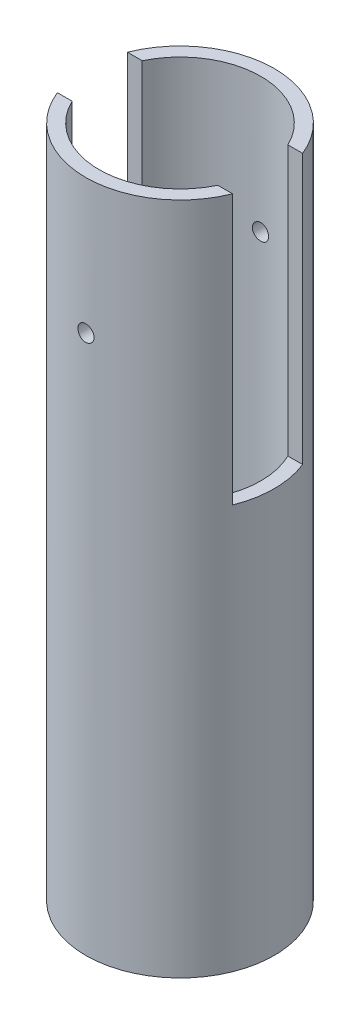
ISO-10303-21;
HEADER;
FILE_DESCRIPTION(('STEP AP214'),'2;1');
FILE_NAME('part.step','',(''),(''),'','','');
FILE_SCHEMA(('AUTOMOTIVE_DESIGN { 1 0 10303 214 1 1 1 1 }'));
ENDSEC;
DATA;
#1=APPLICATION_CONTEXT('core data for automotive mechanical design processes');
#2=APPLICATION_PROTOCOL_DEFINITION('international standard','automotive_design',2000,#1);
#3=PRODUCT_CONTEXT('',#1,'mechanical');
#4=PRODUCT('Part','Part','',(#3));
#5=PRODUCT_RELATED_PRODUCT_CATEGORY('part','',(#4));
#6=PRODUCT_DEFINITION_FORMATION('','',#4);
#7=PRODUCT_DEFINITION_CONTEXT('part definition',#1,'design');
#8=PRODUCT_DEFINITION('design','',#6,#7);
#9=PRODUCT_DEFINITION_SHAPE('','',#8);
#10=(LENGTH_UNIT() NAMED_UNIT(*) SI_UNIT(.MILLI.,.METRE.));
#11=(NAMED_UNIT(*) PLANE_ANGLE_UNIT() SI_UNIT($,.RADIAN.));
#12=(NAMED_UNIT(*) SI_UNIT($,.STERADIAN.) SOLID_ANGLE_UNIT());
#13=UNCERTAINTY_MEASURE_WITH_UNIT(LENGTH_MEASURE(1.E-05),#10,'distance_accuracy_value','');
#14=(GEOMETRIC_REPRESENTATION_CONTEXT(3) GLOBAL_UNCERTAINTY_ASSIGNED_CONTEXT((#13)) GLOBAL_UNIT_ASSIGNED_CONTEXT((#10,
#11,#12)) REPRESENTATION_CONTEXT('',''));
#15=CARTESIAN_POINT('',(0.,0.,0.));
#16=DIRECTION('',(0.,0.,1.));
#17=DIRECTION('',(1.,0.,0.));
#18=AXIS2_PLACEMENT_3D('',#15,#16,#17);
#19=CARTESIAN_POINT('',(0.,250.,0.));
#20=DIRECTION('',(0.,-1.,0.));
#21=DIRECTION('',(0.,0.,-1.));
#22=AXIS2_PLACEMENT_3D('',#19,#20,#21);
#23=CYLINDRICAL_SURFACE('',#22,35.);
#24=CARTESIAN_POINT('',(0.,150.,0.));
#25=DIRECTION('',(0.,-1.,0.));
#26=DIRECTION('',(0.,0.,-1.));
#27=AXIS2_PLACEMENT_3D('',#24,#25,#26);
#28=CIRCLE('',#27,35.);
#29=CARTESIAN_POINT('',(32.4961536185439,150.,-13.));
#30=VERTEX_POINT('',#29);
#31=CARTESIAN_POINT('',(32.4961536185439,150.,13.));
#32=VERTEX_POINT('',#31);
#33=EDGE_CURVE('E194',#30,#32,#28,.T.);
#34=ORIENTED_EDGE('',*,*,#33,.T.);
#35=DIRECTION('',(0.,-1.,0.));
#36=VECTOR('',#35,1.);
#37=CARTESIAN_POINT('',(32.4961536185439,250.,13.));
#38=LINE('',#37,#36);
#39=CARTESIAN_POINT('',(32.4961536185439,250.,13.));
#40=VERTEX_POINT('',#39);
#41=EDGE_CURVE('E117',#32,#40,#38,.F.);
#42=ORIENTED_EDGE('',*,*,#41,.T.);
#43=CARTESIAN_POINT('',(0.,250.,0.));
#44=DIRECTION('',(0.,1.,0.));
#45=DIRECTION('',(0.,0.,1.));
#46=AXIS2_PLACEMENT_3D('',#43,#44,#45);
#47=CIRCLE('',#46,35.);
#48=CARTESIAN_POINT('',(-32.4961536185439,250.,13.));
#49=VERTEX_POINT('',#48);
#50=EDGE_CURVE('E135',#49,#40,#47,.T.);
#51=ORIENTED_EDGE('',*,*,#50,.F.);
#52=DIRECTION('',(0.,-1.,0.));
#53=VECTOR('',#52,1.);
#54=CARTESIAN_POINT('',(-32.4961536185439,250.,13.));
#55=LINE('',#54,#53);
#56=CARTESIAN_POINT('',(-32.4961536185439,150.,13.));
#57=VERTEX_POINT('',#56);
#58=EDGE_CURVE('E198',#49,#57,#55,.T.);
#59=ORIENTED_EDGE('',*,*,#58,.T.);
#60=CARTESIAN_POINT('',(-32.4961536185439,150.,-13.));
#61=VERTEX_POINT('',#60);
#62=EDGE_CURVE('E192',#57,#61,#28,.T.);
#63=ORIENTED_EDGE('',*,*,#62,.T.);
#64=DIRECTION('',(0.,-1.,0.));
#65=VECTOR('',#64,1.);
#66=CARTESIAN_POINT('',(-32.4961536185439,250.,-13.));
#67=LINE('',#66,#65);
#68=CARTESIAN_POINT('',(-32.4961536185439,250.,-13.));
#69=VERTEX_POINT('',#68);
#70=EDGE_CURVE('E118',#61,#69,#67,.F.);
#71=ORIENTED_EDGE('',*,*,#70,.T.);
#72=CARTESIAN_POINT('',(32.4961536185439,250.,-13.));
#73=VERTEX_POINT('',#72);
#74=EDGE_CURVE('E125',#73,#69,#47,.T.);
#75=ORIENTED_EDGE('',*,*,#74,.F.);
#76=DIRECTION('',(0.,-1.,0.));
#77=VECTOR('',#76,1.);
#78=CARTESIAN_POINT('',(32.4961536185439,250.,-13.));
#79=LINE('',#78,#77);
#80=EDGE_CURVE('E109',#73,#30,#79,.T.);
#81=ORIENTED_EDGE('',*,*,#80,.T.);
#82=EDGE_LOOP('',(#34,#42,#51,#59,#63,#71,#75,#81));
#83=FACE_BOUND('',#82,.T.);
#84=CARTESIAN_POINT('',(0.,0.,0.));
#85=DIRECTION('',(0.,1.,0.));
#86=DIRECTION('',(0.,0.,1.));
#87=AXIS2_PLACEMENT_3D('',#84,#85,#86);
#88=CIRCLE('',#87,35.);
#89=CARTESIAN_POINT('',(0.,0.,35.));
#90=VERTEX_POINT('',#89);
#91=EDGE_CURVE('E141',#90,#90,#88,.T.);
#92=ORIENTED_EDGE('',*,*,#91,.T.);
#93=EDGE_LOOP('',(#92));
#94=FACE_BOUND('',#93,.T.);
#95=CARTESIAN_POINT('',(-3.,200.,34.8711915483254));
#96=CARTESIAN_POINT('',(-2.99999266095691,199.831821102203,34.8711932525099));
#97=CARTESIAN_POINT('',(-2.98581034508464,199.663528144414,34.8724213033618));
#98=CARTESIAN_POINT('',(-2.92944387718635,199.331599928892,34.8772006862277));
#99=CARTESIAN_POINT('',(-2.88722811123404,199.167970147446,34.8807546411484));
#100=CARTESIAN_POINT('',(-2.77602575299662,198.850223683519,34.8897803696251));
#101=CARTESIAN_POINT('',(-2.70705447640827,198.696101616918,34.8952510458163));
#102=CARTESIAN_POINT('',(-2.54432647781202,198.401658201319,34.9074924396004));
#103=CARTESIAN_POINT('',(-2.45057500494258,198.261333938189,34.9142628817837));
#104=CARTESIAN_POINT('',(-2.24067380704696,197.998053178991,34.9283615283204));
#105=CARTESIAN_POINT('',(-2.12447081430968,197.875139216507,34.9356910335478));
#106=CARTESIAN_POINT('',(-1.87307803845591,197.650533664264,34.9500700569052));
#107=CARTESIAN_POINT('',(-1.73788742116143,197.548843007391,34.9571195627167));
#108=CARTESIAN_POINT('',(-1.45210217047512,197.369428303622,34.9701567059702));
#109=CARTESIAN_POINT('',(-1.30148426539791,197.291741196092,34.9761427008053));
#110=CARTESIAN_POINT('',(-0.989282152733714,197.162775126391,34.9863643242021));
#111=CARTESIAN_POINT('',(-0.827698147061474,197.111495678133,34.9905999849818));
#112=CARTESIAN_POINT('',(-0.498575054218787,197.036923375591,34.9968345988916));
#113=CARTESIAN_POINT('',(-0.331051705301404,197.013561529096,34.9988390650836));
#114=CARTESIAN_POINT('',(0.00554951687181424,196.995274283088,35.0004041331516));
#115=CARTESIAN_POINT('',(0.174627359650706,197.00034832725,34.9999647828389));
#116=CARTESIAN_POINT('',(0.509070191841323,197.038732461029,34.9966962646731));
#117=CARTESIAN_POINT('',(0.674443766007419,197.071968360384,34.9938733761383));
#118=CARTESIAN_POINT('',(0.997256506055926,197.165617371239,34.9861624784117));
#119=CARTESIAN_POINT('',(1.15469559272899,197.226030753991,34.9812744486083));
#120=CARTESIAN_POINT('',(1.45740602670417,197.372402327149,34.9699723253966));
#121=CARTESIAN_POINT('',(1.60266125610829,197.458393691861,34.9635562523037));
#122=CARTESIAN_POINT('',(1.87670479976716,197.653456162197,34.9499189285463));
#123=CARTESIAN_POINT('',(2.00549276025419,197.762527763522,34.9426976605898));
#124=CARTESIAN_POINT('',(2.24337983249144,198.001072588412,34.9282339351113));
#125=CARTESIAN_POINT('',(2.35241430046894,198.130610288232,34.9209914841214));
#126=CARTESIAN_POINT('',(2.54719973764136,198.406185663845,34.9073249949716));
#127=CARTESIAN_POINT('',(2.63295068598783,198.552223354413,34.9009009575446));
#128=CARTESIAN_POINT('',(2.77873275129373,198.856699191142,34.8895975532274));
#129=CARTESIAN_POINT('',(2.83876042932542,199.015138991986,34.8847183928937));
#130=CARTESIAN_POINT('',(2.93134369450066,199.339899488625,34.8770612464214));
#131=CARTESIAN_POINT('',(2.963899893167,199.506220008906,34.8742832135113));
#132=CARTESIAN_POINT('',(3.00053403997774,199.841454809508,34.8711505281844));
#133=CARTESIAN_POINT('',(3.0047021728709,200.010359165826,34.8707882014983));
#134=CARTESIAN_POINT('',(2.98467818807446,200.346464168516,34.872507698123));
#135=CARTESIAN_POINT('',(2.96048635048195,200.513664831697,34.8745894972945));
#136=CARTESIAN_POINT('',(2.88450436177439,200.841356805181,34.8809556846261));
#137=CARTESIAN_POINT('',(2.83275637092661,201.001857962115,34.8852367076732));
#138=CARTESIAN_POINT('',(2.7031738953256,201.311900038895,34.8955161982866));
#139=CARTESIAN_POINT('',(2.62533896819066,201.461440772822,34.9015146949777));
#140=CARTESIAN_POINT('',(2.44556416469073,201.745729568008,34.914571856145));
#141=CARTESIAN_POINT('',(2.34356423538402,201.880439531393,34.9216331455838));
#142=CARTESIAN_POINT('',(2.11844147546403,202.130857644882,34.9360114257588));
#143=CARTESIAN_POINT('',(1.99531826047652,202.246565449136,34.9433284211461));
#144=CARTESIAN_POINT('',(1.7310540273121,202.456002972884,34.9574165642762));
#145=CARTESIAN_POINT('',(1.58986645530174,202.549674065437,34.9641862252016));
#146=CARTESIAN_POINT('',(1.2937129987535,202.711976771721,34.9763954820041));
#147=CARTESIAN_POINT('',(1.1387472587636,202.780608648103,34.9818350918327));
#148=CARTESIAN_POINT('',(0.819645734517395,202.890784208708,34.9907645239193));
#149=CARTESIAN_POINT('',(0.655522504793548,202.932364035361,34.9942569467868));
#150=CARTESIAN_POINT('',(0.322592960793775,202.987373301382,34.998909077746));
#151=CARTESIAN_POINT('',(0.153786740881574,203.000803307562,35.000068832807));
#152=CARTESIAN_POINT('',(-0.18313937081056,202.999124917863,34.9999250150549));
#153=CARTESIAN_POINT('',(-0.351259728396029,202.984107842017,34.9986293246391));
#154=CARTESIAN_POINT('',(-0.682581136937832,202.926152140857,34.9937357808951));
#155=CARTESIAN_POINT('',(-0.845782181536317,202.883213479458,34.9901379245917));
#156=CARTESIAN_POINT('',(-1.16263730873111,202.770656978123,34.9810436514562));
#157=CARTESIAN_POINT('',(-1.31629202900732,202.701040922428,34.9755473615978));
#158=CARTESIAN_POINT('',(-1.60974810184892,202.537116115368,34.9632708237673));
#159=CARTESIAN_POINT('',(-1.74954965509232,202.44280772177,34.9564905943986));
#160=CARTESIAN_POINT('',(-2.01179846018097,202.231832438459,34.9423810754166));
#161=CARTESIAN_POINT('',(-2.1341911912239,202.115097886127,34.9350501661676));
#162=CARTESIAN_POINT('',(-2.35769690654863,201.86270820728,34.9206793149367));
#163=CARTESIAN_POINT('',(-2.45880473667583,201.727048511219,34.9136394437606));
#164=CARTESIAN_POINT('',(-2.63701593547982,201.440381334994,34.9006328206687));
#165=CARTESIAN_POINT('',(-2.71407186567635,201.289344293521,34.8946681991704));
#166=CARTESIAN_POINT('',(-2.84163046603466,200.97652677724,34.8845133075443));
#167=CARTESIAN_POINT('',(-2.89216358839389,200.814758864634,34.8803210036088));
#168=CARTESIAN_POINT('',(-2.95240722581038,200.543367921921,34.8752608485375));
#169=CARTESIAN_POINT('',(-2.97023070444527,200.435489042881,34.8737419022807));
#170=CARTESIAN_POINT('',(-2.9940294579401,200.218422813093,34.871706700165));
#171=CARTESIAN_POINT('',(-3.00000476685127,200.109235466106,34.8711904414244));
#172=CARTESIAN_POINT('',(-3.,200.,34.8711915483254));
#173=B_SPLINE_CURVE_WITH_KNOTS('',3,(#95,#96,#97,#98,#99,#100,#101,#102,#103,#104,#105,#106,
#107,#108,#109,#110,#111,#112,#113,#114,#115,#116,#117,#118,#119,#120,#121,#122,#123,#124,#125,
#126,#127,#128,#129,#130,#131,#132,#133,#134,#135,#136,#137,#138,#139,#140,#141,#142,#143,#144,
#145,#146,#147,#148,#149,#150,#151,#152,#153,#154,#155,#156,#157,#158,#159,#160,#161,#162,#163,
#164,#165,#166,#167,#168,#169,#170,#171,#172),.UNSPECIFIED.,.T.,.F.,(4,2,2,2,2,2,2,2,2,2,2,2,2,
2,2,2,2,2,2,2,2,2,2,2,2,2,2,2,2,2,2,2,2,2,2,2,2,2,4),(0.,0.504137845154914,1.00884518512539,
1.51326404003695,2.01757613044267,2.52309976273197,3.02864561100069,3.53496561920688,
4.04127630725862,4.54633315507158,5.05138012191659,5.55510070289602,6.05882631148132,
6.56320811562684,7.06760075362891,7.57361533214637,8.07963036375612,8.5857130231065,
9.09178441661877,9.59624734203881,10.1007052851759,10.6043936277358,11.1080905122643,
11.6130525231886,12.1180237237333,12.6243235404852,13.1306180462274,13.6362347291713,
14.1418412311696,14.6458273992463,15.1498142186598,15.6537673362459,16.1577131524622,
16.6632040203355,17.1688171527569,17.6754213142689,18.1814425380561,18.5088908177617,
18.836338156391),.UNSPECIFIED.);
#174=CARTESIAN_POINT('',(-3.,200.,34.8711915483254));
#175=VERTEX_POINT('',#174);
#176=EDGE_CURVE('E173',#175,#175,#173,.T.);
#177=ORIENTED_EDGE('',*,*,#176,.F.);
#178=EDGE_LOOP('',(#177));
#179=FACE_BOUND('',#178,.T.);
#180=CARTESIAN_POINT('',(0.,203.,-35.));
#181=CARTESIAN_POINT('',(0.168180177421425,202.999992662109,-34.9999983189466));
#182=CARTESIAN_POINT('',(0.336474410694066,202.985810137713,-34.9987748870089));
#183=CARTESIAN_POINT('',(0.668405276387219,202.929442766229,-34.9940120055983));
#184=CARTESIAN_POINT('',(0.83203643352241,202.887226309608,-34.9904699418268));
#185=CARTESIAN_POINT('',(1.14978580604665,202.776021930849,-34.9814700099417));
#186=CARTESIAN_POINT('',(1.30390939390645,202.707049291531,-34.9760132356579));
#187=CARTESIAN_POINT('',(1.59835535724251,202.544318084042,-34.9637955952331));
#188=CARTESIAN_POINT('',(1.73868064875921,202.450564768367,-34.9570350055299));
#189=CARTESIAN_POINT('',(2.00196024172096,202.240661711051,-34.9429478698077));
#190=CARTESIAN_POINT('',(2.12487233650439,202.124459113201,-34.9356200130702));
#191=CARTESIAN_POINT('',(2.34947428548936,201.873067910644,-34.9212352148941));
#192=CARTESIAN_POINT('',(2.45116320107853,201.737878466671,-34.9141782854488));
#193=CARTESIAN_POINT('',(2.63057608789142,201.452094239057,-34.9011203668809));
#194=CARTESIAN_POINT('',(2.70826279885841,201.301475982001,-34.895121025662));
#195=CARTESIAN_POINT('',(2.83722803822898,200.989273104178,-34.8848727505605));
#196=CARTESIAN_POINT('',(2.88850705745045,200.827688687293,-34.8806237841455));
#197=CARTESIAN_POINT('',(2.96307845769353,200.498564355711,-34.8743684880487));
#198=CARTESIAN_POINT('',(2.98643979537529,200.331040171612,-34.8723566335604));
#199=CARTESIAN_POINT('',(3.00472573441206,199.99443731567,-34.8707859372111));
#200=CARTESIAN_POINT('',(2.99965089755265,199.825358674601,-34.8712270468893));
#201=CARTESIAN_POINT('',(2.96126551313284,199.490919350092,-34.874507414771));
#202=CARTESIAN_POINT('',(2.92802995365881,199.325549988661,-34.8773403039272));
#203=CARTESIAN_POINT('',(2.83438308452454,199.002745498755,-34.8850750500347));
#204=CARTESIAN_POINT('',(2.77397149596722,198.845310451727,-34.8899769282192));
#205=CARTESIAN_POINT('',(2.62760362876988,198.542604897609,-34.9013046627491));
#206=CARTESIAN_POINT('',(2.54161375570937,198.397350712459,-34.9077325210554));
#207=CARTESIAN_POINT('',(2.34655446417304,198.123308623825,-34.9213861292491));
#208=CARTESIAN_POINT('',(2.23748455081154,197.994521073515,-34.9286118962437));
#209=CARTESIAN_POINT('',(1.99894091774494,197.756632078236,-34.9430754969892));
#210=CARTESIAN_POINT('',(1.86940237855327,197.647595618331,-34.9503132942366));
#211=CARTESIAN_POINT('',(1.59382461581758,197.452806562923,-34.9639632077666));
#212=CARTESIAN_POINT('',(1.44778538038974,197.367053984188,-34.9703753234546));
#213=CARTESIAN_POINT('',(1.14330913680172,197.221270748101,-34.9816527329005));
#214=CARTESIAN_POINT('',(0.984870717201071,197.161243024146,-34.9865178502383));
#215=CARTESIAN_POINT('',(0.660113221128357,197.068659243345,-34.9941511080319));
#216=CARTESIAN_POINT('',(0.493794317781501,197.036102583286,-34.9969192945321));
#217=CARTESIAN_POINT('',(0.15856025083397,196.99946669791,-35.0000408811528));
#218=CARTESIAN_POINT('',(-0.0103450366761332,196.995297722862,-35.0004018916599));
#219=CARTESIAN_POINT('',(-0.346452104482664,197.015320355765,-34.9986887867208));
#220=CARTESIAN_POINT('',(-0.513653901587621,197.039511683609,-34.9966146953254));
#221=CARTESIAN_POINT('',(-0.841351421558973,197.115493822336,-34.9902695086844));
#222=CARTESIAN_POINT('',(-1.00185687270475,197.167242977163,-34.9860017297263));
#223=CARTESIAN_POINT('',(-1.31190702245476,197.296829220066,-34.9757485102754));
#224=CARTESIAN_POINT('',(-1.46145153801856,197.374666743679,-34.9697630411066));
#225=CARTESIAN_POINT('',(-1.7457428816744,197.554445352945,-34.9567262474856));
#226=CARTESIAN_POINT('',(-1.88045202960912,197.656445831527,-34.9496723123826));
#227=CARTESIAN_POINT('',(-2.13086824169311,197.881569219925,-34.9352996751561));
#228=CARTESIAN_POINT('',(-2.2465749564484,198.004692518036,-34.9279809681673));
#229=CARTESIAN_POINT('',(-2.45601016602156,198.268956269739,-34.9138810732733));
#230=CARTESIAN_POINT('',(-2.54968004901866,198.410143263562,-34.9071013498897));
#231=CARTESIAN_POINT('',(-2.71198063229129,198.706295245022,-34.8948680127784));
#232=CARTESIAN_POINT('',(-2.78061159495577,198.861260088256,-34.8894143851545));
#233=CARTESIAN_POINT('',(-2.89078654245641,199.180362211124,-34.8804590783594));
#234=CARTESIAN_POINT('',(-2.93236627395852,199.344487073444,-34.8769548240937));
#235=CARTESIAN_POINT('',(-2.98737479633476,199.677420057378,-34.872286503041));
#236=CARTESIAN_POINT('',(-3.00080416271621,199.846228083177,-34.871122388412));
#237=CARTESIAN_POINT('',(-2.99912392353084,200.18315306479,-34.8712668950776));
#238=CARTESIAN_POINT('',(-2.98410640669543,200.351270490929,-34.8725675374249));
#239=CARTESIAN_POINT('',(-2.92615085557176,200.682585927448,-34.8774780477604));
#240=CARTESIAN_POINT('',(-2.88321277999481,200.845783930554,-34.8810879191635));
#241=CARTESIAN_POINT('',(-2.77065857920719,201.162633021574,-34.8902080316544));
#242=CARTESIAN_POINT('',(-2.70104425727074,201.316284753986,-34.8957181442861));
#243=CARTESIAN_POINT('',(-2.53712384137618,201.609735575797,-34.9080181097009));
#244=CARTESIAN_POINT('',(-2.4428181018962,201.749534864026,-34.9148079441114));
#245=CARTESIAN_POINT('',(-2.23184571903132,202.01178384594,-34.9289284828145));
#246=CARTESIAN_POINT('',(-2.11511080731055,202.134178533017,-34.9362607952504));
#247=CARTESIAN_POINT('',(-1.86271960746937,202.357688026767,-34.9506254222313));
#248=CARTESIAN_POINT('',(-1.72705875414517,202.458797684383,-34.9576576638589));
#249=CARTESIAN_POINT('',(-1.44039065385251,202.637010828441,-34.9706432183248));
#250=CARTESIAN_POINT('',(-1.28935405311576,202.714067210346,-34.9765944046818));
#251=CARTESIAN_POINT('',(-0.976537475486436,202.841626777667,-34.9867226680456));
#252=CARTESIAN_POINT('',(-0.814770058056753,202.892160408851,-34.9909017781752));
#253=CARTESIAN_POINT('',(-0.54337775149265,202.952405494307,-34.9959451685553));
#254=CARTESIAN_POINT('',(-0.435496910992704,202.970229624453,-34.9974587860022));
#255=CARTESIAN_POINT('',(-0.218426750644094,202.994029243567,-34.9994867462511));
#256=CARTESIAN_POINT('',(-0.109237434508939,203.000004766153,-35.0000010918883));
#257=CARTESIAN_POINT('',(0.,203.,-35.));
#258=B_SPLINE_CURVE_WITH_KNOTS('',3,(#180,#181,#182,#183,#184,#185,#186,#187,#188,#189,#190,
#191,#192,#193,#194,#195,#196,#197,#198,#199,#200,#201,#202,#203,#204,#205,#206,#207,#208,#209,
#210,#211,#212,#213,#214,#215,#216,#217,#218,#219,#220,#221,#222,#223,#224,#225,#226,#227,#228,
#229,#230,#231,#232,#233,#234,#235,#236,#237,#238,#239,#240,#241,#242,#243,#244,#245,#246,#247,
#248,#249,#250,#251,#252,#253,#254,#255,#256,#257),.UNSPECIFIED.,.T.,.F.,(4,2,2,2,2,2,2,2,2,2,2,
2,2,2,2,2,2,2,2,2,2,2,2,2,2,2,2,2,2,2,2,2,2,2,2,2,2,2,4),(0.,0.504141688620748,1.0088527873041,
1.51327602436423,2.01759242981481,2.5231110330061,3.0286519884333,3.53497383147415,
4.04128626359052,4.54634550220952,5.05139476290402,5.55510335902216,6.05881712462464,
6.56319540924794,7.06758450992203,7.57360414720597,8.07962414892789,8.58570183661504,
9.09176841150507,9.59623427417643,10.1006951543972,10.6043956535469,11.1081045622491,
11.6130646830275,12.1180340873686,12.6243317573246,13.1306241215114,13.636246082805,
14.1418577070399,14.6458353534656,15.1498137451707,15.6537580747011,16.1576951698375,
16.6631911333163,17.1688092410494,17.6754113983993,18.1814307424438,18.5088849156758,
18.8363381597995),.UNSPECIFIED.);
#259=CARTESIAN_POINT('',(0.,203.,-35.));
#260=VERTEX_POINT('',#259);
#261=EDGE_CURVE('E178',#260,#260,#258,.T.);
#262=ORIENTED_EDGE('',*,*,#261,.F.);
#263=EDGE_LOOP('',(#262));
#264=FACE_BOUND('',#263,.T.);
#265=ADVANCED_FACE('F39',(#83,#94,#179,#264),#23,.T.);
#266=CARTESIAN_POINT('',(0.,250.,0.));
#267=DIRECTION('',(0.,-1.,0.));
#268=DIRECTION('',(0.,0.,-1.));
#269=AXIS2_PLACEMENT_3D('',#266,#267,#268);
#270=CYLINDRICAL_SURFACE('',#269,30.);
#271=CARTESIAN_POINT('',(-3.,200.,29.8496231131986));
#272=CARTESIAN_POINT('',(-2.99999272017989,199.831941307473,29.8496250836601));
#273=CARTESIAN_POINT('',(-2.98583057694392,199.663771494745,29.8510577086842));
#274=CARTESIAN_POINT('',(-2.92954894428733,199.332094441101,29.856632625566));
#275=CARTESIAN_POINT('',(-2.88739864465899,199.168592545884,29.8607779035211));
#276=CARTESIAN_POINT('',(-2.77638034820807,198.851102542353,29.8713039917368));
#277=CARTESIAN_POINT('',(-2.70752854888204,198.697108731827,29.8776834464881));
#278=CARTESIAN_POINT('',(-2.54509280217295,198.402896623123,29.8919574170702));
#279=CARTESIAN_POINT('',(-2.45151376687767,198.262675596548,29.8998516319072));
#280=CARTESIAN_POINT('',(-2.24191428599619,197.999446209028,29.9162978013197));
#281=CARTESIAN_POINT('',(-2.12582225432479,197.876494971489,29.9248518001641));
#282=CARTESIAN_POINT('',(-1.87464514595866,197.651787172989,29.9416351570655));
#283=CARTESIAN_POINT('',(-1.73955920071969,197.550031581781,29.9498645002548));
#284=CARTESIAN_POINT('',(-1.45387908495295,197.370406228979,29.9650914946698));
#285=CARTESIAN_POINT('',(-1.30325298758869,197.292587003619,29.9720865268398));
#286=CARTESIAN_POINT('',(-0.990989952862505,197.163366700554,29.9840345062727));
#287=CARTESIAN_POINT('',(-0.829353284004632,197.111964978892,29.9889875033118));
#288=CARTESIAN_POINT('',(-0.500234348228826,197.03720627194,29.9962789971309));
#289=CARTESIAN_POINT('',(-0.332773581094722,197.01375550175,29.9986262352845));
#290=CARTESIAN_POINT('',(0.00372222206684858,196.995274192599,30.0004714679607));
#291=CARTESIAN_POINT('',(0.172757217163402,197.000242916761,29.9999695363582));
#292=CARTESIAN_POINT('',(0.506966532193697,197.03838341795,29.9961801393356));
#293=CARTESIAN_POINT('',(0.672152489804954,197.071454346692,29.9929026345514));
#294=CARTESIAN_POINT('',(0.994617538513614,197.16470338684,29.9839418779479));
#295=CARTESIAN_POINT('',(1.1518965268732,197.224881850363,29.9782585948786));
#296=CARTESIAN_POINT('',(1.45440094403877,197.370748289763,29.9651081245175));
#297=CARTESIAN_POINT('',(1.59960471294496,197.45648089259,29.9576378209727));
#298=CARTESIAN_POINT('',(1.87360053952259,197.650989570009,29.9417515355822));
#299=CARTESIAN_POINT('',(2.00239211568249,197.759766320436,29.9333355260043));
#300=CARTESIAN_POINT('',(2.24049831546807,197.997842688541,29.9164588040355));
#301=CARTESIAN_POINT('',(2.34972523857104,198.127230034225,29.9079980571908));
#302=CARTESIAN_POINT('',(2.54492260607376,198.402550595632,29.8920221978467));
#303=CARTESIAN_POINT('',(2.63089301673868,198.548483835356,29.8845070867189));
#304=CARTESIAN_POINT('',(2.7771365537197,198.852821075599,29.8712726854245));
#305=CARTESIAN_POINT('',(2.8374042617189,199.011227697269,29.8655537739766));
#306=CARTESIAN_POINT('',(2.93046220691278,199.335981813844,29.8565670561281));
#307=CARTESIAN_POINT('',(2.96325328122911,199.502329066662,29.853299175053));
#308=CARTESIAN_POINT('',(3.00031432617588,199.837472538589,29.8495974158225));
#309=CARTESIAN_POINT('',(3.00470698994163,200.006255060795,29.8491513464281));
#310=CARTESIAN_POINT('',(2.98516874061409,200.342153797469,29.8511115406431));
#311=CARTESIAN_POINT('',(2.96123821022926,200.509270034421,29.8535177657118));
#312=CARTESIAN_POINT('',(2.88583552352256,200.836734746835,29.860900332672));
#313=CARTESIAN_POINT('',(2.83442138156671,200.997096713284,29.8658712600404));
#314=CARTESIAN_POINT('',(2.7055701590278,201.306920155191,29.8778187311638));
#315=CARTESIAN_POINT('',(2.62813248235075,201.456381380862,29.8847953208601));
#316=CARTESIAN_POINT('',(2.44912500426963,201.740719922086,29.8999975306714));
#317=CARTESIAN_POINT('',(2.34747389952206,201.875545825899,29.9082273244401));
#318=CARTESIAN_POINT('',(2.12304160035352,202.126265159822,29.9249949787556));
#319=CARTESIAN_POINT('',(2.0002598827444,202.24215812102,29.933532846926));
#320=CARTESIAN_POINT('',(1.73651941267942,202.452144900194,29.949991435479));
#321=CARTESIAN_POINT('',(1.59549676790834,202.546158678759,29.9579098216642));
#322=CARTESIAN_POINT('',(1.29959315225138,202.709167605519,29.9722032631989));
#323=CARTESIAN_POINT('',(1.14471237128886,202.778163096521,29.9785783396948));
#324=CARTESIAN_POINT('',(0.825768379298431,202.889041302966,29.9890563124202));
#325=CARTESIAN_POINT('',(0.661722112949863,202.930972361976,29.9931632581695));
#326=CARTESIAN_POINT('',(0.328874441951021,202.98668920874,29.9986588384095));
#327=CARTESIAN_POINT('',(0.160073171076636,203.000475787502,30.0000475492969));
#328=CARTESIAN_POINT('',(-0.176706672227253,202.99950120068,29.9999501493981));
#329=CARTESIAN_POINT('',(-0.344685621673594,202.98486428949,29.9984765513001));
#330=CARTESIAN_POINT('',(-0.675785665069099,202.927718763029,29.9928448073277));
#331=CARTESIAN_POINT('',(-0.838906755205111,202.885210125881,29.9886866593462));
#332=CARTESIAN_POINT('',(-1.15565972630324,202.773562227821,29.9781517144188));
#333=CARTESIAN_POINT('',(-1.30929289823259,202.704426599198,29.9717752200974));
#334=CARTESIAN_POINT('',(-1.60279380046439,202.541500493249,29.9575143724889));
#335=CARTESIAN_POINT('',(-1.74266161130568,202.447710160187,29.9496300280247));
#336=CARTESIAN_POINT('',(-2.00529817328081,202.237671142929,29.9331955400715));
#337=CARTESIAN_POINT('',(-2.12799277865801,202.121329951266,29.9246427438206));
#338=CARTESIAN_POINT('',(-2.35217327817942,201.869673945364,29.9078577230902));
#339=CARTESIAN_POINT('',(-2.45365407554355,201.734354584493,29.8996255760348));
#340=CARTESIAN_POINT('',(-2.63272992127216,201.44820697424,29.8843915023165));
#341=CARTESIAN_POINT('',(-2.7102635639845,201.297340156028,29.8773927577534));
#342=CARTESIAN_POINT('',(-2.83879412429633,200.984755126261,29.8654558428796));
#343=CARTESIAN_POINT('',(-2.88982097366964,200.823049388223,29.8605153496223));
#344=CARTESIAN_POINT('',(-2.95116506500056,200.550356777302,29.8545002261302));
#345=CARTESIAN_POINT('',(-2.96945313719456,200.44111324608,29.8526799580266));
#346=CARTESIAN_POINT('',(-2.99387297581546,200.221262530873,29.8502407553741));
#347=CARTESIAN_POINT('',(-3.00000479327221,200.110655352614,29.8496218157822));
#348=CARTESIAN_POINT('',(-3.,200.,29.8496231131986));
#349=B_SPLINE_CURVE_WITH_KNOTS('',3,(#271,#272,#273,#274,#275,#276,#277,#278,#279,#280,#281,
#282,#283,#284,#285,#286,#287,#288,#289,#290,#291,#292,#293,#294,#295,#296,#297,#298,#299,#300,
#301,#302,#303,#304,#305,#306,#307,#308,#309,#310,#311,#312,#313,#314,#315,#316,#317,#318,#319,
#320,#321,#322,#323,#324,#325,#326,#327,#328,#329,#330,#331,#332,#333,#334,#335,#336,#337,#338,
#339,#340,#341,#342,#343,#344,#345,#346,#347,#348),.UNSPECIFIED.,.T.,.F.,(4,2,2,2,2,2,2,2,2,2,2,
2,2,2,2,2,2,2,2,2,2,2,2,2,2,2,2,2,2,2,2,2,2,2,2,2,2,2,4),(0.,0.503771983318802,1.00809945548363,
1.51212147301074,2.01604344128227,2.52159484591606,3.0271693756759,3.53380409915707,
4.04042647225217,4.54534412697181,5.05024868996528,5.55334895457816,6.05645575444754,
6.56044636401072,7.06445175657417,7.57066275256836,8.07687448284521,8.58319287355637,
9.08949583786932,9.59360988925127,10.0977171290244,10.6007644411541,11.1038232768498,
11.6085956943698,12.1133806117144,12.6199841045619,13.1265806555585,13.6322697808491,
14.1379446934128,14.6414140040728,15.1448837099181,15.6482847598757,16.1516828643423,
16.6571914511579,17.1628213510541,17.6697372321326,18.1760794468383,18.5077808281997,
18.8394808171328),.UNSPECIFIED.);
#350=CARTESIAN_POINT('',(-3.,200.,29.8496231131986));
#351=VERTEX_POINT('',#350);
#352=EDGE_CURVE('E151',#351,#351,#349,.T.);
#353=ORIENTED_EDGE('',*,*,#352,.T.);
#354=EDGE_LOOP('',(#353));
#355=FACE_BOUND('',#354,.T.);
#356=DIRECTION('',(0.,-1.,0.));
#357=VECTOR('',#356,1.);
#358=CARTESIAN_POINT('',(27.0370116691916,250.,13.));
#359=LINE('',#358,#357);
#360=CARTESIAN_POINT('',(27.0370116691916,150.,13.));
#361=VERTEX_POINT('',#360);
#362=CARTESIAN_POINT('',(27.0370116691916,250.,13.));
#363=VERTEX_POINT('',#362);
#364=EDGE_CURVE('E11',#361,#363,#359,.F.);
#365=ORIENTED_EDGE('',*,*,#364,.F.);
#366=CARTESIAN_POINT('',(0.,150.,0.));
#367=DIRECTION('',(0.,-1.,0.));
#368=DIRECTION('',(0.,0.,-1.));
#369=AXIS2_PLACEMENT_3D('',#366,#367,#368);
#370=CIRCLE('',#369,30.);
#371=CARTESIAN_POINT('',(27.0370116691915,150.,-13.));
#372=VERTEX_POINT('',#371);
#373=EDGE_CURVE('E139',#372,#361,#370,.T.);
#374=ORIENTED_EDGE('',*,*,#373,.F.);
#375=DIRECTION('',(0.,-1.,0.));
#376=VECTOR('',#375,1.);
#377=CARTESIAN_POINT('',(27.0370116691915,250.,-13.));
#378=LINE('',#377,#376);
#379=CARTESIAN_POINT('',(27.0370116691915,250.,-13.));
#380=VERTEX_POINT('',#379);
#381=EDGE_CURVE('E53',#380,#372,#378,.T.);
#382=ORIENTED_EDGE('',*,*,#381,.F.);
#383=CARTESIAN_POINT('',(0.,250.,0.));
#384=DIRECTION('',(0.,1.,0.));
#385=DIRECTION('',(0.,0.,1.));
#386=AXIS2_PLACEMENT_3D('',#383,#384,#385);
#387=CIRCLE('',#386,30.);
#388=CARTESIAN_POINT('',(-27.0370116691915,250.,-13.));
#389=VERTEX_POINT('',#388);
#390=EDGE_CURVE('E127',#380,#389,#387,.T.);
#391=ORIENTED_EDGE('',*,*,#390,.T.);
#392=DIRECTION('',(0.,-1.,0.));
#393=VECTOR('',#392,1.);
#394=CARTESIAN_POINT('',(-27.0370116691915,250.,-13.));
#395=LINE('',#394,#393);
#396=CARTESIAN_POINT('',(-27.0370116691915,150.,-13.));
#397=VERTEX_POINT('',#396);
#398=EDGE_CURVE('E137',#397,#389,#395,.F.);
#399=ORIENTED_EDGE('',*,*,#398,.F.);
#400=CARTESIAN_POINT('',(-27.0370116691916,150.,13.));
#401=VERTEX_POINT('',#400);
#402=EDGE_CURVE('E134',#401,#397,#370,.T.);
#403=ORIENTED_EDGE('',*,*,#402,.F.);
#404=DIRECTION('',(0.,-1.,0.));
#405=VECTOR('',#404,1.);
#406=CARTESIAN_POINT('',(-27.0370116691916,250.,13.));
#407=LINE('',#406,#405);
#408=CARTESIAN_POINT('',(-27.0370116691916,250.,13.));
#409=VERTEX_POINT('',#408);
#410=EDGE_CURVE('E149',#409,#401,#407,.T.);
#411=ORIENTED_EDGE('',*,*,#410,.F.);
#412=EDGE_CURVE('E200',#409,#363,#387,.T.);
#413=ORIENTED_EDGE('',*,*,#412,.T.);
#414=EDGE_LOOP('',(#365,#374,#382,#391,#399,#403,#411,#413));
#415=FACE_BOUND('',#414,.T.);
#416=CARTESIAN_POINT('',(0.,0.,0.));
#417=DIRECTION('',(0.,1.,0.));
#418=DIRECTION('',(0.,0.,1.));
#419=AXIS2_PLACEMENT_3D('',#416,#417,#418);
#420=CIRCLE('',#419,30.);
#421=CARTESIAN_POINT('',(0.,0.,30.));
#422=VERTEX_POINT('',#421);
#423=EDGE_CURVE('E144',#422,#422,#420,.T.);
#424=ORIENTED_EDGE('',*,*,#423,.F.);
#425=EDGE_LOOP('',(#424));
#426=FACE_BOUND('',#425,.T.);
#427=CARTESIAN_POINT('',(0.,203.,-30.));
#428=CARTESIAN_POINT('',(0.168061061374672,202.999992722299,-29.9999980656231));
#429=CARTESIAN_POINT('',(0.336233235503319,202.985830193311,-29.9985727678862));
#430=CARTESIAN_POINT('',(0.667915195490511,202.929546889129,-29.9930240278421));
#431=CARTESIAN_POINT('',(0.831419637506484,202.887395311926,-29.9888976130208));
#432=CARTESIAN_POINT('',(1.14891502636025,202.776373278207,-29.9784124368921));
#433=CARTESIAN_POINT('',(1.30291165384473,202.707518958445,-29.9720550240212));
#434=CARTESIAN_POINT('',(1.59712848288123,202.545077276205,-29.9578187218292));
#435=CARTESIAN_POINT('',(1.73735141633724,202.451494832,-29.9499401351439));
#436=CARTESIAN_POINT('',(2.00057865202225,202.241891907013,-29.9335123302397));
#437=CARTESIAN_POINT('',(2.12352643450469,202.125800601794,-29.924961047216));
#438=CARTESIAN_POINT('',(2.34822756429296,201.874626397211,-29.9081687071879));
#439=CARTESIAN_POINT('',(2.44997993124796,201.739542619873,-29.8999276645475));
#440=CARTESIAN_POINT('',(2.62960191133085,201.453864404949,-29.8846677465835));
#441=CARTESIAN_POINT('',(2.70742039636464,201.303237667715,-29.8776515013271));
#442=CARTESIAN_POINT('',(2.83663915422828,200.990973242285,-29.8656611263957));
#443=CARTESIAN_POINT('',(2.88804007977387,200.829335826248,-29.8606869462667));
#444=CARTESIAN_POINT('',(2.96279712480568,200.500214597402,-29.8533625221893));
#445=CARTESIAN_POINT('',(2.98624695901139,200.332752269443,-29.8510035119429));
#446=CARTESIAN_POINT('',(3.00472585540608,199.996253409813,-29.8491492918158));
#447=CARTESIAN_POINT('',(2.9997556646124,199.827216919634,-29.8496540066624));
#448=CARTESIAN_POINT('',(2.96161284075803,199.49301407092,-29.853462206968));
#449=CARTESIAN_POINT('',(2.92854253237365,199.327835902014,-29.8567555377195));
#450=CARTESIAN_POINT('',(2.83529743245176,199.005386110397,-29.8657540286226));
#451=CARTESIAN_POINT('',(2.77512227476724,198.848114594525,-29.8714592213548));
#452=CARTESIAN_POINT('',(2.62926268164453,198.545619238103,-29.8846502835621));
#453=CARTESIAN_POINT('',(2.54353284815995,198.400417431532,-29.8921393172447));
#454=CARTESIAN_POINT('',(2.34903008205969,198.126424355264,-29.9080515519864));
#455=CARTESIAN_POINT('',(2.24025647500952,197.997633566055,-29.9164747803835));
#456=CARTESIAN_POINT('',(2.0021823372362,197.759523818033,-29.9333515593897));
#457=CARTESIAN_POINT('',(1.87279343655409,197.650293194358,-29.9418050799899));
#458=CARTESIAN_POINT('',(1.59746844521133,197.455089101269,-29.9577548723555));
#459=CARTESIAN_POINT('',(1.45153233599879,197.369115657931,-29.9652511430477));
#460=CARTESIAN_POINT('',(1.14719431707709,197.222869939069,-29.9784442700129));
#461=CARTESIAN_POINT('',(0.988790239169708,197.162602145546,-29.9841408124431));
#462=CARTESIAN_POINT('',(0.664041651989798,197.069543249865,-29.9930894232423));
#463=CARTESIAN_POINT('',(0.4976973803298,197.036751326028,-29.9963415647119));
#464=CARTESIAN_POINT('',(0.162555297275707,196.999687076796,-30.0000255500493));
#465=CARTESIAN_POINT('',(-0.00622890631648106,196.995292855242,-30.0004694480321));
#466=CARTESIAN_POINT('',(-0.342131379947104,197.014828589146,-29.9985192527039));
#467=CARTESIAN_POINT('',(-0.509249672461414,197.038758161946,-29.996125197734));
#468=CARTESIAN_POINT('',(-0.836724620504033,197.114161086265,-29.9887758461758));
#469=CARTESIAN_POINT('',(-0.997094546916071,197.165577363434,-29.9838258575412));
#470=CARTESIAN_POINT('',(-1.30693296415136,197.294435522112,-29.9719199658183));
#471=CARTESIAN_POINT('',(-1.45640121047136,197.371877987118,-29.9649640177576));
#472=CARTESIAN_POINT('',(-1.74074454051643,197.550892515992,-29.9497942599127));
#473=CARTESIAN_POINT('',(-1.87556897924675,197.652544666777,-29.9415763081032));
#474=CARTESIAN_POINT('',(-2.12628486993564,197.876978203223,-29.9248179860856));
#475=CARTESIAN_POINT('',(-2.24217584654753,197.999760119211,-29.9162776077891));
#476=CARTESIAN_POINT('',(-2.45215832966144,198.263499723977,-29.8998007242226));
#477=CARTESIAN_POINT('',(-2.54616983603864,198.404521269628,-29.8918665041693));
#478=CARTESIAN_POINT('',(-2.70917477623149,198.70042208044,-29.8775349738267));
#479=CARTESIAN_POINT('',(-2.77816855216166,198.855301156065,-29.8711376425211));
#480=CARTESIAN_POINT('',(-2.88904562605343,199.174246218397,-29.8606184290215));
#481=CARTESIAN_POINT('',(-2.93097652443559,199.338295520273,-29.8564925534936));
#482=CARTESIAN_POINT('',(-2.98669202138839,199.671149593882,-29.8509709584863));
#483=CARTESIAN_POINT('',(-3.00047742719855,199.839954229087,-29.8495751607056));
#484=CARTESIAN_POINT('',(-2.99949941541377,200.17673206507,-29.8496733932269));
#485=CARTESIAN_POINT('',(-2.98486166877933,200.344705648648,-29.8511547026103));
#486=CARTESIAN_POINT('',(-2.92771635889096,200.675794751505,-29.8568131166864));
#487=CARTESIAN_POINT('',(-2.88520876428648,200.838910265318,-29.8609902244115));
#488=CARTESIAN_POINT('',(-2.77356505889251,201.155652047144,-29.8715660478956));
#489=CARTESIAN_POINT('',(-2.70443263302275,201.309279624889,-29.8779644562108));
#490=CARTESIAN_POINT('',(-2.54151466473313,201.602770675013,-29.8922625551808));
#491=CARTESIAN_POINT('',(-2.44772926036624,201.742634224462,-29.9001622374285));
#492=CARTESIAN_POINT('',(-2.23769566885598,202.005271023416,-29.9166146162909));
#493=CARTESIAN_POINT('',(-2.12135384667079,202.127969229101,-29.9251699418025));
#494=CARTESIAN_POINT('',(-1.86969509767532,202.352156698099,-29.9419456418635));
#495=CARTESIAN_POINT('',(-1.73437363232477,202.453640874072,-29.9501659356893));
#496=CARTESIAN_POINT('',(-1.44822430248387,202.632720361564,-29.9653668620748));
#497=CARTESIAN_POINT('',(-1.29735824804029,202.710254872836,-29.9723443208044));
#498=CARTESIAN_POINT('',(-0.98477483730165,202.838787268472,-29.9842388774969));
#499=CARTESIAN_POINT('',(-0.823069949476829,202.889815072861,-29.9891582972896));
#500=CARTESIAN_POINT('',(-0.550374784217115,202.951161851254,-29.995146413212));
#501=CARTESIAN_POINT('',(-0.441127658533528,202.969451132898,-29.996958020755));
#502=CARTESIAN_POINT('',(-0.221269742451939,202.993872578185,-29.9993854485236));
#503=CARTESIAN_POINT('',(-0.110658957679674,203.000004791966,-30.0000012736807));
#504=CARTESIAN_POINT('',(0.,203.,-30.));
#505=B_SPLINE_CURVE_WITH_KNOTS('',3,(#427,#428,#429,#430,#431,#432,#433,#434,#435,#436,#437,
#438,#439,#440,#441,#442,#443,#444,#445,#446,#447,#448,#449,#450,#451,#452,#453,#454,#455,#456,
#457,#458,#459,#460,#461,#462,#463,#464,#465,#466,#467,#468,#469,#470,#471,#472,#473,#474,#475,
#476,#477,#478,#479,#480,#481,#482,#483,#484,#485,#486,#487,#488,#489,#490,#491,#492,#493,#494,
#495,#496,#497,#498,#499,#500,#501,#502,#503,#504),.UNSPECIFIED.,.T.,.F.,(4,2,2,2,2,2,2,2,2,2,2,
2,2,2,2,2,2,2,2,2,2,2,2,2,2,2,2,2,2,2,2,2,2,2,2,2,2,2,4),(0.,0.503779098805421,1.00811352850646,
1.51214365719661,2.01607361274836,2.52161570586886,3.02718117662116,3.53381926416666,
4.04044483327511,4.54536696135591,5.05027581767331,5.55335392323331,6.05643882484899,
6.56042284118683,7.06442160993376,7.57064202588621,8.07686300939316,8.58317222080744,
9.08946629026319,9.59358565823273,10.0976982155743,10.6007680588292,11.103849181484,
11.608618222461,12.1133999343069,12.619999308258,13.1265917542612,13.6322907177901,
14.1379751771876,14.6414288788187,15.1448831467812,15.648267760884,16.1516495561688,
16.6571675228296,17.1628065791087,17.6697189307873,18.1760578438588,18.5077700169705,
18.8394808220708),.UNSPECIFIED.);
#506=CARTESIAN_POINT('',(0.,203.,-30.));
#507=VERTEX_POINT('',#506);
#508=EDGE_CURVE('E43',#507,#507,#505,.T.);
#509=ORIENTED_EDGE('',*,*,#508,.T.);
#510=EDGE_LOOP('',(#509));
#511=FACE_BOUND('',#510,.T.);
#512=ADVANCED_FACE('F156',(#355,#415,#426,#511),#270,.F.);
#513=CARTESIAN_POINT('',(0.,250.,0.));
#514=DIRECTION('',(0.,1.,0.));
#515=DIRECTION('',(0.,0.,1.));
#516=AXIS2_PLACEMENT_3D('',#513,#514,#515);
#517=PLANE('',#516);
#518=DIRECTION('',(1.,0.,0.));
#519=VECTOR('',#518,1.);
#520=CARTESIAN_POINT('',(-62.095,250.,13.));
#521=LINE('',#520,#519);
#522=EDGE_CURVE('E187',#49,#409,#521,.T.);
#523=ORIENTED_EDGE('',*,*,#522,.F.);
#524=ORIENTED_EDGE('',*,*,#50,.T.);
#525=EDGE_CURVE('E128',#363,#40,#521,.T.);
#526=ORIENTED_EDGE('',*,*,#525,.F.);
#527=ORIENTED_EDGE('',*,*,#412,.F.);
#528=EDGE_LOOP('',(#523,#524,#526,#527));
#529=FACE_BOUND('',#528,.T.);
#530=ADVANCED_FACE('F213',(#529),#517,.T.);
#531=DIRECTION('',(-1.,0.,0.));
#532=VECTOR('',#531,1.);
#533=CARTESIAN_POINT('',(-62.095,250.,-13.));
#534=LINE('',#533,#532);
#535=EDGE_CURVE('E112',#73,#380,#534,.T.);
#536=ORIENTED_EDGE('',*,*,#535,.F.);
#537=ORIENTED_EDGE('',*,*,#74,.T.);
#538=EDGE_CURVE('E129',#389,#69,#534,.T.);
#539=ORIENTED_EDGE('',*,*,#538,.F.);
#540=ORIENTED_EDGE('',*,*,#390,.F.);
#541=EDGE_LOOP('',(#536,#537,#539,#540));
#542=FACE_BOUND('',#541,.T.);
#543=ADVANCED_FACE('F123',(#542),#517,.T.);
#544=CARTESIAN_POINT('',(0.,0.,0.));
#545=DIRECTION('',(0.,1.,0.));
#546=DIRECTION('',(0.,0.,1.));
#547=AXIS2_PLACEMENT_3D('',#544,#545,#546);
#548=PLANE('',#547);
#549=ORIENTED_EDGE('',*,*,#91,.F.);
#550=EDGE_LOOP('',(#549));
#551=FACE_BOUND('',#550,.T.);
#552=ORIENTED_EDGE('',*,*,#423,.T.);
#553=EDGE_LOOP('',(#552));
#554=FACE_BOUND('',#553,.T.);
#555=ADVANCED_FACE('F209',(#551,#554),#548,.F.);
#556=CARTESIAN_POINT('',(0.,150.,0.));
#557=DIRECTION('',(0.,-1.,0.));
#558=DIRECTION('',(0.,0.,-1.));
#559=AXIS2_PLACEMENT_3D('',#556,#557,#558);
#560=PLANE('',#559);
#561=DIRECTION('',(1.,0.,0.));
#562=VECTOR('',#561,1.);
#563=CARTESIAN_POINT('',(-62.095,150.,13.));
#564=LINE('',#563,#562);
#565=EDGE_CURVE('E69',#57,#401,#564,.T.);
#566=ORIENTED_EDGE('',*,*,#565,.T.);
#567=ORIENTED_EDGE('',*,*,#402,.T.);
#568=DIRECTION('',(-1.,0.,0.));
#569=VECTOR('',#568,1.);
#570=CARTESIAN_POINT('',(-62.095,150.,-13.));
#571=LINE('',#570,#569);
#572=EDGE_CURVE('E184',#397,#61,#571,.T.);
#573=ORIENTED_EDGE('',*,*,#572,.T.);
#574=ORIENTED_EDGE('',*,*,#62,.F.);
#575=EDGE_LOOP('',(#566,#567,#573,#574));
#576=FACE_BOUND('',#575,.T.);
#577=ADVANCED_FACE('F254',(#576),#560,.F.);
#578=CARTESIAN_POINT('',(-62.095,150.,-13.));
#579=DIRECTION('',(0.,0.,-1.));
#580=DIRECTION('',(-1.,0.,0.));
#581=AXIS2_PLACEMENT_3D('',#578,#579,#580);
#582=PLANE('',#581);
#583=ORIENTED_EDGE('',*,*,#572,.F.);
#584=ORIENTED_EDGE('',*,*,#398,.T.);
#585=ORIENTED_EDGE('',*,*,#538,.T.);
#586=ORIENTED_EDGE('',*,*,#70,.F.);
#587=EDGE_LOOP('',(#583,#584,#585,#586));
#588=FACE_BOUND('',#587,.T.);
#589=ADVANCED_FACE('F261',(#588),#582,.F.);
#590=CARTESIAN_POINT('',(-62.095,150.,13.));
#591=DIRECTION('',(0.,0.,1.));
#592=DIRECTION('',(1.,0.,0.));
#593=AXIS2_PLACEMENT_3D('',#590,#591,#592);
#594=PLANE('',#593);
#595=ORIENTED_EDGE('',*,*,#522,.T.);
#596=ORIENTED_EDGE('',*,*,#410,.T.);
#597=ORIENTED_EDGE('',*,*,#565,.F.);
#598=ORIENTED_EDGE('',*,*,#58,.F.);
#599=EDGE_LOOP('',(#595,#596,#597,#598));
#600=FACE_BOUND('',#599,.T.);
#601=ADVANCED_FACE('F268',(#600),#594,.F.);
#602=EDGE_CURVE('E188',#361,#32,#564,.T.);
#603=ORIENTED_EDGE('',*,*,#602,.F.);
#604=ORIENTED_EDGE('',*,*,#364,.T.);
#605=ORIENTED_EDGE('',*,*,#525,.T.);
#606=ORIENTED_EDGE('',*,*,#41,.F.);
#607=EDGE_LOOP('',(#603,#604,#605,#606));
#608=FACE_BOUND('',#607,.T.);
#609=ADVANCED_FACE('F260',(#608),#594,.F.);
#610=ORIENTED_EDGE('',*,*,#535,.T.);
#611=ORIENTED_EDGE('',*,*,#381,.T.);
#612=EDGE_CURVE('E61',#30,#372,#571,.T.);
#613=ORIENTED_EDGE('',*,*,#612,.F.);
#614=ORIENTED_EDGE('',*,*,#80,.F.);
#615=EDGE_LOOP('',(#610,#611,#613,#614));
#616=FACE_BOUND('',#615,.T.);
#617=ADVANCED_FACE('F111',(#616),#582,.F.);
#618=ORIENTED_EDGE('',*,*,#612,.T.);
#619=ORIENTED_EDGE('',*,*,#373,.T.);
#620=ORIENTED_EDGE('',*,*,#602,.T.);
#621=ORIENTED_EDGE('',*,*,#33,.F.);
#622=EDGE_LOOP('',(#618,#619,#620,#621));
#623=FACE_BOUND('',#622,.T.);
#624=ADVANCED_FACE('F166',(#623),#560,.F.);
#625=CARTESIAN_POINT('',(0.,200.,100.));
#626=DIRECTION('',(0.,0.,-1.));
#627=DIRECTION('',(-1.,0.,0.));
#628=AXIS2_PLACEMENT_3D('',#625,#626,#627);
#629=CYLINDRICAL_SURFACE('',#628,3.);
#630=ORIENTED_EDGE('',*,*,#352,.F.);
#631=EDGE_LOOP('',(#630));
#632=FACE_BOUND('',#631,.T.);
#633=ORIENTED_EDGE('',*,*,#176,.T.);
#634=EDGE_LOOP('',(#633));
#635=FACE_BOUND('',#634,.T.);
#636=ADVANCED_FACE('F164',(#632,#635),#629,.F.);
#637=ORIENTED_EDGE('',*,*,#508,.F.);
#638=EDGE_LOOP('',(#637));
#639=FACE_BOUND('',#638,.T.);
#640=ORIENTED_EDGE('',*,*,#261,.T.);
#641=EDGE_LOOP('',(#640));
#642=FACE_BOUND('',#641,.T.);
#643=ADVANCED_FACE('F160',(#639,#642),#629,.F.);
#644=CLOSED_SHELL('',(#265,#512,#530,#543,#555,#577,#589,#601,#609,#617,#624,#636,#643));
#645=MANIFOLD_SOLID_BREP('B2',#644);
#646=ADVANCED_BREP_SHAPE_REPRESENTATION('',(#18,#645),#14);
#647=SHAPE_DEFINITION_REPRESENTATION(#9,#646);
ENDSEC;
END-ISO-10303-21;
